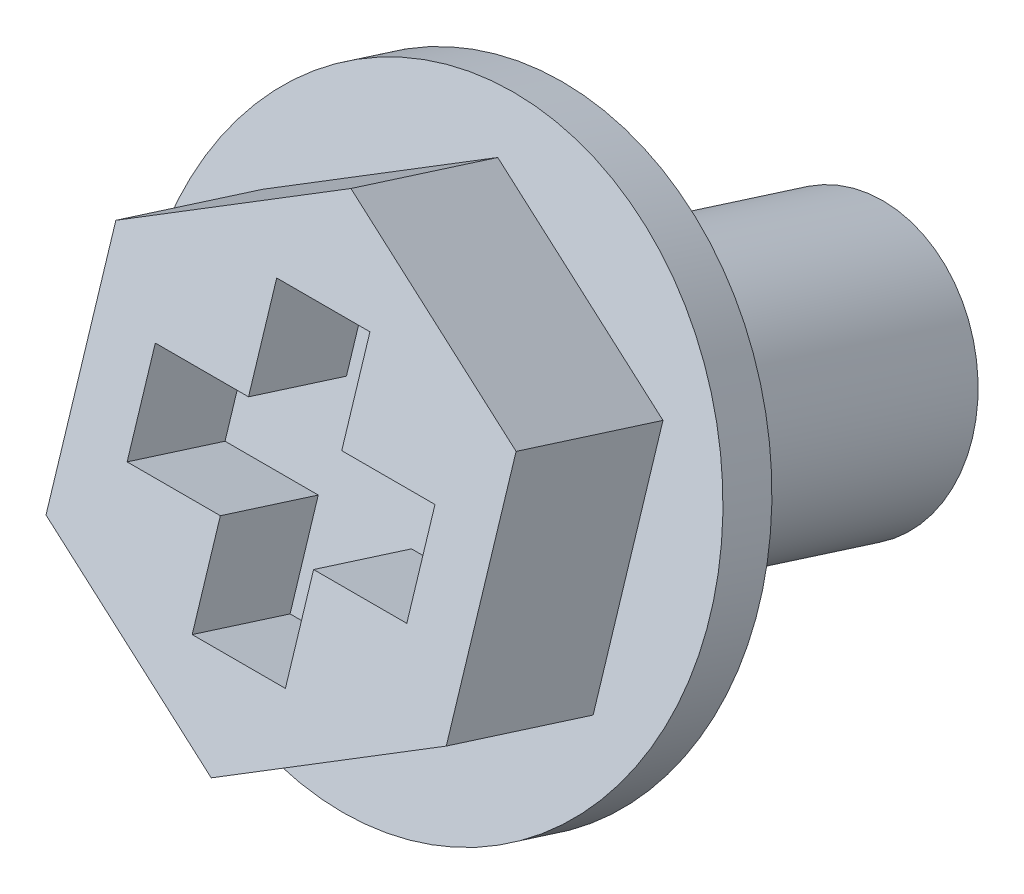
ISO-10303-21;
HEADER;
FILE_DESCRIPTION(('STEP AP214'),'2;1');
FILE_NAME('part.step','',(''),(''),'','','');
FILE_SCHEMA(('AUTOMOTIVE_DESIGN { 1 0 10303 214 1 1 1 1 }'));
ENDSEC;
DATA;
#1=APPLICATION_CONTEXT('core data for automotive mechanical design processes');
#2=APPLICATION_PROTOCOL_DEFINITION('international standard','automotive_design',2000,#1);
#3=PRODUCT_CONTEXT('',#1,'mechanical');
#4=PRODUCT('Part','Part','',(#3));
#5=PRODUCT_RELATED_PRODUCT_CATEGORY('part','',(#4));
#6=PRODUCT_DEFINITION_FORMATION('','',#4);
#7=PRODUCT_DEFINITION_CONTEXT('part definition',#1,'design');
#8=PRODUCT_DEFINITION('design','',#6,#7);
#9=PRODUCT_DEFINITION_SHAPE('','',#8);
#10=(LENGTH_UNIT() NAMED_UNIT(*) SI_UNIT(.MILLI.,.METRE.));
#11=(NAMED_UNIT(*) PLANE_ANGLE_UNIT() SI_UNIT($,.RADIAN.));
#12=(NAMED_UNIT(*) SI_UNIT($,.STERADIAN.) SOLID_ANGLE_UNIT());
#13=UNCERTAINTY_MEASURE_WITH_UNIT(LENGTH_MEASURE(1.E-05),#10,'distance_accuracy_value','');
#14=(GEOMETRIC_REPRESENTATION_CONTEXT(3) GLOBAL_UNCERTAINTY_ASSIGNED_CONTEXT((#13)) GLOBAL_UNIT_ASSIGNED_CONTEXT((#10,
#11,#12)) REPRESENTATION_CONTEXT('',''));
#15=CARTESIAN_POINT('',(0.,0.,0.));
#16=DIRECTION('',(0.,0.,1.));
#17=DIRECTION('',(1.,0.,0.));
#18=AXIS2_PLACEMENT_3D('',#15,#16,#17);
#19=CARTESIAN_POINT('',(-127.5890637903,-47.17862964954,96.08173783615));
#20=DIRECTION('',(0.,0.302243860733609,0.95323063769942));
#21=DIRECTION('',(0.,0.95323063769942,-0.302243860733609));
#22=AXIS2_PLACEMENT_3D('',#19,#20,#21);
#23=PLANE('',#22);
#24=DIRECTION('',(-1.,0.,0.));
#25=VECTOR('',#24,1.);
#26=CARTESIAN_POINT('',(-132.23623307405,-43.6140055370607,94.9514911663381));
#27=LINE('',#26,#25);
#28=CARTESIAN_POINT('',(-131.328582823293,-43.6140055370648,94.9514911663404));
#29=VERTEX_POINT('',#28);
#30=CARTESIAN_POINT('',(-133.143883324725,-43.6140055370635,94.9514911663399));
#31=VERTEX_POINT('',#30);
#32=EDGE_CURVE('E167',#29,#31,#27,.T.);
#33=ORIENTED_EDGE('',*,*,#32,.T.);
#34=DIRECTION('',(0.,-0.953230637698745,0.302243860735739));
#35=VECTOR('',#34,1.);
#36=CARTESIAN_POINT('',(-133.1438833247,-44.4792055643657,95.225822882313));
#37=LINE('',#36,#35);
#38=CARTESIAN_POINT('',(-133.143883324725,-45.3444055916671,95.500154598288));
#39=VERTEX_POINT('',#38);
#40=EDGE_CURVE('E149',#31,#39,#37,.T.);
#41=ORIENTED_EDGE('',*,*,#40,.T.);
#42=DIRECTION('',(1.,0.,0.));
#43=VECTOR('',#42,1.);
#44=CARTESIAN_POINT('',(-132.23623307405,-45.3444055916706,95.5001545982879));
#45=LINE('',#44,#43);
#46=CARTESIAN_POINT('',(-131.328582823307,-45.3444055916672,95.5001545982876));
#47=VERTEX_POINT('',#46);
#48=EDGE_CURVE('E155',#39,#47,#45,.T.);
#49=ORIENTED_EDGE('',*,*,#48,.T.);
#50=DIRECTION('',(0.,-0.95323063770021,0.302243860731118));
#51=VECTOR('',#50,1.);
#52=CARTESIAN_POINT('',(-131.3285828233,-46.2096056189657,95.774486314258));
#53=LINE('',#52,#51);
#54=CARTESIAN_POINT('',(-131.328582823278,-47.0748056462668,96.048818030231));
#55=VERTEX_POINT('',#54);
#56=EDGE_CURVE('E272',#47,#55,#53,.T.);
#57=ORIENTED_EDGE('',*,*,#56,.T.);
#58=DIRECTION('',(1.,0.,0.));
#59=VECTOR('',#58,1.);
#60=CARTESIAN_POINT('',(-130.42093257255,-47.0748056462706,96.0488180302281));
#61=LINE('',#60,#59);
#62=CARTESIAN_POINT('',(-129.513282321847,-47.0748056462669,96.048818030231));
#63=VERTEX_POINT('',#62);
#64=EDGE_CURVE('E278',#55,#63,#61,.T.);
#65=ORIENTED_EDGE('',*,*,#64,.T.);
#66=DIRECTION('',(0.,0.95323063770021,-0.302243860731118));
#67=VECTOR('',#66,1.);
#68=CARTESIAN_POINT('',(-129.5132823219,-46.2096056189657,95.774486314258));
#69=LINE('',#68,#67);
#70=CARTESIAN_POINT('',(-129.513282321857,-45.3444055916658,95.5001545982876));
#71=VERTEX_POINT('',#70);
#72=EDGE_CURVE('E284',#63,#71,#69,.T.);
#73=ORIENTED_EDGE('',*,*,#72,.T.);
#74=DIRECTION('',(1.,0.,0.));
#75=VECTOR('',#74,1.);
#76=CARTESIAN_POINT('',(-128.60563207115,-45.3444055916706,95.5001545982879));
#77=LINE('',#76,#75);
#78=CARTESIAN_POINT('',(-127.6979818204,-45.3444055916672,95.5001545982881));
#79=VERTEX_POINT('',#78);
#80=EDGE_CURVE('E290',#71,#79,#77,.T.);
#81=ORIENTED_EDGE('',*,*,#80,.T.);
#82=DIRECTION('',(0.,0.953230637698745,-0.302243860735739));
#83=VECTOR('',#82,1.);
#84=CARTESIAN_POINT('',(-127.6979818204,-44.4792055643657,95.225822882313));
#85=LINE('',#84,#83);
#86=CARTESIAN_POINT('',(-127.6979818204,-43.6140055370635,94.9514911663399));
#87=VERTEX_POINT('',#86);
#88=EDGE_CURVE('E296',#79,#87,#85,.T.);
#89=ORIENTED_EDGE('',*,*,#88,.T.);
#90=DIRECTION('',(-1.,0.,0.));
#91=VECTOR('',#90,1.);
#92=CARTESIAN_POINT('',(-128.60563207115,-43.6140055370607,94.9514911663381));
#93=LINE('',#92,#91);
#94=CARTESIAN_POINT('',(-129.513282321857,-43.6140055370649,94.9514911663404));
#95=VERTEX_POINT('',#94);
#96=EDGE_CURVE('E302',#87,#95,#93,.T.);
#97=ORIENTED_EDGE('',*,*,#96,.T.);
#98=DIRECTION('',(0.,0.953230637700231,-0.302243860731052));
#99=VECTOR('',#98,1.);
#100=CARTESIAN_POINT('',(-129.5132823219,-42.7488055097657,94.6771594503679));
#101=LINE('',#100,#99);
#102=CARTESIAN_POINT('',(-129.513282321847,-41.8836054824638,94.4028277343946));
#103=VERTEX_POINT('',#102);
#104=EDGE_CURVE('E308',#95,#103,#101,.T.);
#105=ORIENTED_EDGE('',*,*,#104,.T.);
#106=DIRECTION('',(-1.,0.,0.));
#107=VECTOR('',#106,1.);
#108=CARTESIAN_POINT('',(-130.42093257255,-41.8836054824608,94.4028277343881));
#109=LINE('',#108,#107);
#110=CARTESIAN_POINT('',(-131.328582823278,-41.8836054824638,94.4028277343945));
#111=VERTEX_POINT('',#110);
#112=EDGE_CURVE('E314',#103,#111,#109,.T.);
#113=ORIENTED_EDGE('',*,*,#112,.T.);
#114=DIRECTION('',(0.,-0.953230637700231,0.302243860731052));
#115=VECTOR('',#114,1.);
#116=CARTESIAN_POINT('',(-131.3285828233,-42.7488055097657,94.6771594503679));
#117=LINE('',#116,#115);
#118=EDGE_CURVE('E320',#111,#29,#117,.T.);
#119=ORIENTED_EDGE('',*,*,#118,.T.);
#120=EDGE_LOOP('',(#33,#41,#49,#57,#65,#73,#81,#89,#97,#105,#113,#119));
#121=FACE_BOUND('',#120,.T.);
#122=ADVANCED_FACE('F17',(#121),#23,.T.);
#123=CARTESIAN_POINT('',(-133.1801893348,-45.3564953461,95.46202537278));
#124=DIRECTION('',(0.,-0.95323063769864,0.30224386073607));
#125=DIRECTION('',(1.,0.,0.));
#126=AXIS2_PLACEMENT_3D('',#123,#124,#125);
#127=PLANE('',#126);
#128=ORIENTED_EDGE('',*,*,#48,.F.);
#129=DIRECTION('',(0.,0.302243860735946,0.953230637698679));
#130=VECTOR('',#129,1.);
#131=CARTESIAN_POINT('',(-133.1438833247,-45.0421617309328,96.453385235986));
#132=LINE('',#131,#130);
#133=CARTESIAN_POINT('',(-133.143883324747,-44.739917870199,97.4066158736839));
#134=VERTEX_POINT('',#133);
#135=EDGE_CURVE('E158',#39,#134,#132,.T.);
#136=ORIENTED_EDGE('',*,*,#135,.T.);
#137=DIRECTION('',(-1.,0.,0.));
#138=VECTOR('',#137,1.);
#139=CARTESIAN_POINT('',(-130.4209325726,-44.7399178701997,97.4066158736883));
#140=LINE('',#139,#138);
#141=CARTESIAN_POINT('',(-131.328582823319,-44.7399178702,97.4066158736834));
#142=VERTEX_POINT('',#141);
#143=EDGE_CURVE('E267',#142,#134,#140,.T.);
#144=ORIENTED_EDGE('',*,*,#143,.F.);
#145=DIRECTION('',(0.,-0.302243860731755,-0.953230637700008));
#146=VECTOR('',#145,1.);
#147=CARTESIAN_POINT('',(-131.3285828233,-45.042161730932,96.4533852359839));
#148=LINE('',#147,#146);
#149=EDGE_CURVE('E160',#142,#47,#148,.T.);
#150=ORIENTED_EDGE('',*,*,#149,.T.);
#151=EDGE_LOOP('',(#128,#136,#144,#150));
#152=FACE_BOUND('',#151,.T.);
#153=ADVANCED_FACE('F156',(#152),#127,.F.);
#154=CARTESIAN_POINT('',(-133.1438833247,-43.5914872904,94.90238867219));
#155=DIRECTION('',(-1.,0.,0.));
#156=DIRECTION('',(0.,-0.953230637698724,0.302243860735803));
#157=AXIS2_PLACEMENT_3D('',#154,#155,#156);
#158=PLANE('',#157);
#159=ORIENTED_EDGE('',*,*,#40,.F.);
#160=DIRECTION('',(0.,0.302243860730305,0.953230637700467));
#161=VECTOR('',#160,1.);
#162=CARTESIAN_POINT('',(-133.143883324771,-43.31176167633,95.90472180404));
#163=LINE('',#162,#161);
#164=CARTESIAN_POINT('',(-133.14388332473,-43.0095178156005,96.8579524417413));
#165=VERTEX_POINT('',#164);
#166=EDGE_CURVE('E322',#31,#165,#163,.T.);
#167=ORIENTED_EDGE('',*,*,#166,.T.);
#168=DIRECTION('',(0.,0.95323063769925,-0.302243860734144));
#169=VECTOR('',#168,1.);
#170=CARTESIAN_POINT('',(-133.143883324748,-43.8747178429,97.132284157715));
#171=LINE('',#170,#169);
#172=EDGE_CURVE('E166',#134,#165,#171,.T.);
#173=ORIENTED_EDGE('',*,*,#172,.F.);
#174=ORIENTED_EDGE('',*,*,#135,.F.);
#175=EDGE_LOOP('',(#159,#167,#173,#174));
#176=FACE_BOUND('',#175,.T.);
#177=ADVANCED_FACE('F165',(#176),#158,.F.);
#178=CARTESIAN_POINT('',(-131.2922768133,-43.62609529149,94.91336194083));
#179=DIRECTION('',(0.,0.953230637700467,-0.302243860730305));
#180=DIRECTION('',(-1.,0.,0.));
#181=AXIS2_PLACEMENT_3D('',#178,#179,#180);
#182=PLANE('',#181);
#183=ORIENTED_EDGE('',*,*,#32,.F.);
#184=DIRECTION('',(0.,0.302243860735982,0.953230637698667));
#185=VECTOR('',#184,1.);
#186=CARTESIAN_POINT('',(-131.3285828233,-43.3117616763328,95.9047218040361));
#187=LINE('',#186,#185);
#188=CARTESIAN_POINT('',(-131.328582823318,-43.009517815599,96.8579524417397));
#189=VERTEX_POINT('',#188);
#190=EDGE_CURVE('E317',#29,#189,#187,.T.);
#191=ORIENTED_EDGE('',*,*,#190,.T.);
#192=DIRECTION('',(1.,0.,0.));
#193=VECTOR('',#192,1.);
#194=CARTESIAN_POINT('',(-130.4209325726,-43.0095178156003,96.8579524417417));
#195=LINE('',#194,#193);
#196=EDGE_CURVE('E264',#165,#189,#195,.T.);
#197=ORIENTED_EDGE('',*,*,#196,.F.);
#198=ORIENTED_EDGE('',*,*,#166,.F.);
#199=EDGE_LOOP('',(#183,#191,#197,#198));
#200=FACE_BOUND('',#199,.T.);
#201=ADVANCED_FACE('F325',(#200),#182,.F.);
#202=CARTESIAN_POINT('',(-131.3285828233,-41.8610872358,94.35372524025));
#203=DIRECTION('',(-1.,0.,0.));
#204=DIRECTION('',(0.,-0.953230637700243,0.302243860731015));
#205=AXIS2_PLACEMENT_3D('',#202,#203,#204);
#206=PLANE('',#205);
#207=ORIENTED_EDGE('',*,*,#118,.F.);
#208=DIRECTION('',(0.,0.302243860730318,0.953230637700463));
#209=VECTOR('',#208,1.);
#210=CARTESIAN_POINT('',(-131.328582823271,-41.58136162173,95.35605837209));
#211=LINE('',#210,#209);
#212=CARTESIAN_POINT('',(-131.328582823297,-41.2791177610006,96.3092890097923));
#213=VERTEX_POINT('',#212);
#214=EDGE_CURVE('E311',#111,#213,#211,.T.);
#215=ORIENTED_EDGE('',*,*,#214,.T.);
#216=DIRECTION('',(0.,0.95323063769925,-0.302243860734144));
#217=VECTOR('',#216,1.);
#218=CARTESIAN_POINT('',(-131.328582823316,-43.8747178429,97.132284157715));
#219=LINE('',#218,#217);
#220=EDGE_CURVE('E262',#189,#213,#219,.T.);
#221=ORIENTED_EDGE('',*,*,#220,.F.);
#222=ORIENTED_EDGE('',*,*,#190,.F.);
#223=EDGE_LOOP('',(#207,#215,#221,#222));
#224=FACE_BOUND('',#223,.T.);
#225=ADVANCED_FACE('F362',(#224),#206,.F.);
#226=CARTESIAN_POINT('',(-129.4769763118,-41.89569523689,94.36469850888));
#227=DIRECTION('',(0.,0.953230637700463,-0.302243860730318));
#228=DIRECTION('',(-1.,0.,0.));
#229=AXIS2_PLACEMENT_3D('',#226,#227,#228);
#230=PLANE('',#229);
#231=ORIENTED_EDGE('',*,*,#112,.F.);
#232=DIRECTION('',(0.,0.302243860731772,0.953230637700002));
#233=VECTOR('',#232,1.);
#234=CARTESIAN_POINT('',(-129.5132823219,-41.5813616217322,95.3560583720939));
#235=LINE('',#234,#233);
#236=CARTESIAN_POINT('',(-129.51328232186,-41.2791177610003,96.3092890097925));
#237=VERTEX_POINT('',#236);
#238=EDGE_CURVE('E305',#103,#237,#235,.T.);
#239=ORIENTED_EDGE('',*,*,#238,.T.);
#240=DIRECTION('',(1.,0.,0.));
#241=VECTOR('',#240,1.);
#242=CARTESIAN_POINT('',(-130.4209325726,-41.2791177610011,96.3092890097952));
#243=LINE('',#242,#241);
#244=EDGE_CURVE('E260',#213,#237,#243,.T.);
#245=ORIENTED_EDGE('',*,*,#244,.F.);
#246=ORIENTED_EDGE('',*,*,#214,.F.);
#247=EDGE_LOOP('',(#231,#239,#245,#246));
#248=FACE_BOUND('',#247,.T.);
#249=ADVANCED_FACE('F359',(#248),#230,.F.);
#250=CARTESIAN_POINT('',(-129.5132823219,-43.66070329259,94.92433520947));
#251=DIRECTION('',(1.,0.,0.));
#252=DIRECTION('',(0.,0.953230637700243,-0.302243860731015));
#253=AXIS2_PLACEMENT_3D('',#250,#251,#252);
#254=PLANE('',#253);
#255=ORIENTED_EDGE('',*,*,#104,.F.);
#256=DIRECTION('',(0.,0.302243860730305,0.953230637700467));
#257=VECTOR('',#256,1.);
#258=CARTESIAN_POINT('',(-129.513282321871,-43.31176167633,95.90472180404));
#259=LINE('',#258,#257);
#260=CARTESIAN_POINT('',(-129.513282321889,-43.0095178155986,96.8579524417375));
#261=VERTEX_POINT('',#260);
#262=EDGE_CURVE('E299',#95,#261,#259,.T.);
#263=ORIENTED_EDGE('',*,*,#262,.T.);
#264=DIRECTION('',(0.,-0.953230637699251,0.302243860734143));
#265=VECTOR('',#264,1.);
#266=CARTESIAN_POINT('',(-129.513282321884,-43.8747178429,97.132284157715));
#267=LINE('',#266,#265);
#268=EDGE_CURVE('E258',#237,#261,#267,.T.);
#269=ORIENTED_EDGE('',*,*,#268,.F.);
#270=ORIENTED_EDGE('',*,*,#238,.F.);
#271=EDGE_LOOP('',(#255,#263,#269,#270));
#272=FACE_BOUND('',#271,.T.);
#273=ADVANCED_FACE('F355',(#272),#254,.F.);
#274=CARTESIAN_POINT('',(-127.6616758104,-43.62609529149,94.91336194083));
#275=DIRECTION('',(0.,0.953230637700467,-0.302243860730305));
#276=DIRECTION('',(-1.,0.,0.));
#277=AXIS2_PLACEMENT_3D('',#274,#275,#276);
#278=PLANE('',#277);
#279=ORIENTED_EDGE('',*,*,#96,.F.);
#280=DIRECTION('',(0.,0.302243860730414,0.953230637700433));
#281=VECTOR('',#280,1.);
#282=CARTESIAN_POINT('',(-127.6979818204,-43.3117616763323,95.904721804039));
#283=LINE('',#282,#281);
#284=CARTESIAN_POINT('',(-127.697981820427,-43.0095178156,96.8579524417416));
#285=VERTEX_POINT('',#284);
#286=EDGE_CURVE('E293',#87,#285,#283,.T.);
#287=ORIENTED_EDGE('',*,*,#286,.T.);
#288=DIRECTION('',(1.,0.,0.));
#289=VECTOR('',#288,1.);
#290=CARTESIAN_POINT('',(-130.4209325726,-43.0095178156003,96.8579524417417));
#291=LINE('',#290,#289);
#292=EDGE_CURVE('E256',#261,#285,#291,.T.);
#293=ORIENTED_EDGE('',*,*,#292,.F.);
#294=ORIENTED_EDGE('',*,*,#262,.F.);
#295=EDGE_LOOP('',(#279,#287,#293,#294));
#296=FACE_BOUND('',#295,.T.);
#297=ADVANCED_FACE('F351',(#296),#278,.F.);
#298=CARTESIAN_POINT('',(-127.6979818204,-45.39110334719,95.47299864142));
#299=DIRECTION('',(1.,0.,0.));
#300=DIRECTION('',(0.,0.953230637698724,-0.302243860735803));
#301=AXIS2_PLACEMENT_3D('',#298,#299,#300);
#302=PLANE('',#301);
#303=ORIENTED_EDGE('',*,*,#88,.F.);
#304=DIRECTION('',(0.,0.30224386073607,0.95323063769864));
#305=VECTOR('',#304,1.);
#306=CARTESIAN_POINT('',(-127.697981820429,-45.042161730935,96.453385235985));
#307=LINE('',#306,#305);
#308=CARTESIAN_POINT('',(-127.69798182042,-44.7399178701985,97.4066158736842));
#309=VERTEX_POINT('',#308);
#310=EDGE_CURVE('E287',#79,#309,#307,.T.);
#311=ORIENTED_EDGE('',*,*,#310,.T.);
#312=DIRECTION('',(0.,-0.95323063769925,0.302243860734144));
#313=VECTOR('',#312,1.);
#314=CARTESIAN_POINT('',(-127.697981820452,-43.8747178429,97.132284157715));
#315=LINE('',#314,#313);
#316=EDGE_CURVE('E254',#285,#309,#315,.T.);
#317=ORIENTED_EDGE('',*,*,#316,.F.);
#318=ORIENTED_EDGE('',*,*,#286,.F.);
#319=EDGE_LOOP('',(#303,#311,#317,#318));
#320=FACE_BOUND('',#319,.T.);
#321=ADVANCED_FACE('F347',(#320),#302,.F.);
#322=CARTESIAN_POINT('',(-129.5495883319,-45.3564953461,95.46202537278));
#323=DIRECTION('',(0.,-0.95323063769864,0.30224386073607));
#324=DIRECTION('',(1.,0.,0.));
#325=AXIS2_PLACEMENT_3D('',#322,#323,#324);
#326=PLANE('',#325);
#327=ORIENTED_EDGE('',*,*,#80,.F.);
#328=DIRECTION('',(0.,0.302243860731753,0.953230637700008));
#329=VECTOR('',#328,1.);
#330=CARTESIAN_POINT('',(-129.5132823219,-45.0421617309323,96.453385235984));
#331=LINE('',#330,#329);
#332=CARTESIAN_POINT('',(-129.513282321882,-44.7399178702,97.4066158736834));
#333=VERTEX_POINT('',#332);
#334=EDGE_CURVE('E281',#71,#333,#331,.T.);
#335=ORIENTED_EDGE('',*,*,#334,.T.);
#336=DIRECTION('',(-1.,0.,0.));
#337=VECTOR('',#336,1.);
#338=CARTESIAN_POINT('',(-130.4209325726,-44.7399178701997,97.4066158736883));
#339=LINE('',#338,#337);
#340=EDGE_CURVE('E252',#309,#333,#339,.T.);
#341=ORIENTED_EDGE('',*,*,#340,.F.);
#342=ORIENTED_EDGE('',*,*,#310,.F.);
#343=EDGE_LOOP('',(#327,#335,#341,#342));
#344=FACE_BOUND('',#343,.T.);
#345=ADVANCED_FACE('F343',(#344),#326,.F.);
#346=CARTESIAN_POINT('',(-129.5132823219,-47.12150340179,96.02166207336));
#347=DIRECTION('',(1.,0.,0.));
#348=DIRECTION('',(0.,0.953230637700249,-0.302243860730994));
#349=AXIS2_PLACEMENT_3D('',#346,#347,#348);
#350=PLANE('',#349);
#351=ORIENTED_EDGE('',*,*,#72,.F.);
#352=DIRECTION('',(0.,0.302243860734677,0.953230637699081));
#353=VECTOR('',#352,1.);
#354=CARTESIAN_POINT('',(-129.513282321829,-46.772561785535,97.00204866793));
#355=LINE('',#354,#353);
#356=CARTESIAN_POINT('',(-129.513282321878,-46.4703179247983,97.9552793056331));
#357=VERTEX_POINT('',#356);
#358=EDGE_CURVE('E275',#63,#357,#355,.T.);
#359=ORIENTED_EDGE('',*,*,#358,.T.);
#360=DIRECTION('',(0.,-0.953230637699251,0.302243860734143));
#361=VECTOR('',#360,1.);
#362=CARTESIAN_POINT('',(-129.513282321884,-43.8747178429,97.132284157715));
#363=LINE('',#362,#361);
#364=EDGE_CURVE('E250',#333,#357,#363,.T.);
#365=ORIENTED_EDGE('',*,*,#364,.F.);
#366=ORIENTED_EDGE('',*,*,#334,.F.);
#367=EDGE_LOOP('',(#351,#359,#365,#366));
#368=FACE_BOUND('',#367,.T.);
#369=ADVANCED_FACE('F339',(#368),#350,.F.);
#370=CARTESIAN_POINT('',(-131.3648888333,-47.0868954007,96.01068880472));
#371=DIRECTION('',(0.,-0.953230637699081,0.302243860734677));
#372=DIRECTION('',(1.,0.,0.));
#373=AXIS2_PLACEMENT_3D('',#370,#371,#372);
#374=PLANE('',#373);
#375=ORIENTED_EDGE('',*,*,#64,.F.);
#376=DIRECTION('',(0.,0.302243860734612,0.953230637699102));
#377=VECTOR('',#376,1.);
#378=CARTESIAN_POINT('',(-131.3285828233,-46.7725617855327,97.002048667931));
#379=LINE('',#378,#377);
#380=CARTESIAN_POINT('',(-131.32858282329,-46.4703179247988,97.9552793056329));
#381=VERTEX_POINT('',#380);
#382=EDGE_CURVE('E269',#55,#381,#379,.T.);
#383=ORIENTED_EDGE('',*,*,#382,.T.);
#384=DIRECTION('',(-1.,0.,0.));
#385=VECTOR('',#384,1.);
#386=CARTESIAN_POINT('',(-130.4209325726,-46.4703179247989,97.9552793056348));
#387=LINE('',#386,#385);
#388=EDGE_CURVE('E248',#357,#381,#387,.T.);
#389=ORIENTED_EDGE('',*,*,#388,.F.);
#390=ORIENTED_EDGE('',*,*,#358,.F.);
#391=EDGE_LOOP('',(#375,#383,#389,#390));
#392=FACE_BOUND('',#391,.T.);
#393=ADVANCED_FACE('F336',(#392),#374,.F.);
#394=CARTESIAN_POINT('',(-131.3285828233,-45.321887345,95.45105210414));
#395=DIRECTION('',(-1.,0.,0.));
#396=DIRECTION('',(0.,-0.953230637700249,0.302243860730994));
#397=AXIS2_PLACEMENT_3D('',#394,#395,#396);
#398=PLANE('',#397);
#399=ORIENTED_EDGE('',*,*,#56,.F.);
#400=ORIENTED_EDGE('',*,*,#149,.F.);
#401=DIRECTION('',(0.,0.95323063769925,-0.302243860734144));
#402=VECTOR('',#401,1.);
#403=CARTESIAN_POINT('',(-131.328582823316,-43.8747178429,97.132284157715));
#404=LINE('',#403,#402);
#405=EDGE_CURVE('E245',#381,#142,#404,.T.);
#406=ORIENTED_EDGE('',*,*,#405,.F.);
#407=ORIENTED_EDGE('',*,*,#382,.F.);
#408=EDGE_LOOP('',(#399,#400,#406,#407));
#409=FACE_BOUND('',#408,.T.);
#410=ADVANCED_FACE('F333',(#409),#398,.F.);
#411=CARTESIAN_POINT('',(-126.3679336829,-48.33583722733,98.54678542595));
#412=DIRECTION('',(0.,0.302243860734144,0.95323063769925));
#413=DIRECTION('',(0.,0.95323063769925,-0.302243860734144));
#414=AXIS2_PLACEMENT_3D('',#411,#412,#413);
#415=PLANE('',#414);
#416=ORIENTED_EDGE('',*,*,#388,.T.);
#417=ORIENTED_EDGE('',*,*,#405,.T.);
#418=ORIENTED_EDGE('',*,*,#143,.T.);
#419=ORIENTED_EDGE('',*,*,#172,.T.);
#420=ORIENTED_EDGE('',*,*,#196,.T.);
#421=ORIENTED_EDGE('',*,*,#220,.T.);
#422=ORIENTED_EDGE('',*,*,#244,.T.);
#423=ORIENTED_EDGE('',*,*,#268,.T.);
#424=ORIENTED_EDGE('',*,*,#292,.T.);
#425=ORIENTED_EDGE('',*,*,#316,.T.);
#426=ORIENTED_EDGE('',*,*,#340,.T.);
#427=ORIENTED_EDGE('',*,*,#364,.T.);
#428=EDGE_LOOP('',(#416,#417,#418,#419,#420,#421,#422,#423,#424,#425,#426,#427));
#429=FACE_BOUND('',#428,.T.);
#430=DIRECTION('',(0.866025403789069,0.476615318842526,-0.151121930362928));
#431=VECTOR('',#430,1.);
#432=CARTESIAN_POINT('',(-132.3694897311,-40.657564440664,96.112211127733));
#433=LINE('',#432,#431);
#434=CARTESIAN_POINT('',(-134.318046889619,-41.7299489080773,96.4522354710616));
#435=VERTEX_POINT('',#434);
#436=CARTESIAN_POINT('',(-130.420932572436,-39.5851799733206,95.7721867844329));
#437=VERTEX_POINT('',#436);
#438=EDGE_CURVE('E192',#435,#437,#433,.T.);
#439=ORIENTED_EDGE('',*,*,#438,.F.);
#440=DIRECTION('',(0.,0.953230637699545,-0.302243860733214));
#441=VECTOR('',#440,1.);
#442=CARTESIAN_POINT('',(-134.3180468896,-43.8747178428991,97.132284157713));
#443=LINE('',#442,#441);
#444=CARTESIAN_POINT('',(-134.318046889634,-46.0194867777211,97.8123328443627));
#445=VERTEX_POINT('',#444);
#446=EDGE_CURVE('E184',#445,#435,#443,.T.);
#447=ORIENTED_EDGE('',*,*,#446,.F.);
#448=DIRECTION('',(-0.866025403788795,0.476615318842377,-0.151121930364968));
#449=VECTOR('',#448,1.);
#450=CARTESIAN_POINT('',(-132.3694897311,-47.091871245134,98.1523571876881));
#451=LINE('',#450,#449);
#452=CARTESIAN_POINT('',(-130.420932572825,-48.1642557124083,98.4923815309728));
#453=VERTEX_POINT('',#452);
#454=EDGE_CURVE('E185',#453,#445,#451,.T.);
#455=ORIENTED_EDGE('',*,*,#454,.F.);
#456=DIRECTION('',(-0.86602540378345,-0.476615318851202,0.151121930367766));
#457=VECTOR('',#456,1.);
#458=CARTESIAN_POINT('',(-128.47237541405,-47.091871245134,98.1523571876881));
#459=LINE('',#458,#457);
#460=CARTESIAN_POINT('',(-126.52381825558,-46.0194867777213,97.812332844363));
#461=VERTEX_POINT('',#460);
#462=EDGE_CURVE('E61',#461,#453,#459,.T.);
#463=ORIENTED_EDGE('',*,*,#462,.F.);
#464=DIRECTION('',(0.,-0.953230637699545,0.302243860733214));
#465=VECTOR('',#464,1.);
#466=CARTESIAN_POINT('',(-126.5238182556,-43.8747178428991,97.132284157713));
#467=LINE('',#466,#465);
#468=CARTESIAN_POINT('',(-126.523818255565,-41.7299489080774,96.4522354710594));
#469=VERTEX_POINT('',#468);
#470=EDGE_CURVE('E179',#469,#461,#467,.T.);
#471=ORIENTED_EDGE('',*,*,#470,.F.);
#472=DIRECTION('',(0.866025403783724,-0.476615318851351,0.151121930365726));
#473=VECTOR('',#472,1.);
#474=CARTESIAN_POINT('',(-128.47237541405,-40.657564440664,96.112211127733));
#475=LINE('',#474,#473);
#476=EDGE_CURVE('E196',#437,#469,#475,.T.);
#477=ORIENTED_EDGE('',*,*,#476,.F.);
#478=EDGE_LOOP('',(#439,#447,#455,#463,#471,#477));
#479=FACE_BOUND('',#478,.T.);
#480=ADVANCED_FACE('F238',(#429,#479),#415,.T.);
#481=CARTESIAN_POINT('',(-134.395989176,-46.90145761287,94.88184611927));
#482=DIRECTION('',(-0.499999999992455,-0.825521947917343,0.261750861534972));
#483=DIRECTION('',(0.866025403788795,-0.476615318842378,0.151121930364965));
#484=AXIS2_PLACEMENT_3D('',#481,#482,#483);
#485=PLANE('',#484);
#486=ORIENTED_EDGE('',*,*,#454,.T.);
#487=DIRECTION('',(0.,0.302243860734128,0.953230637699255));
#488=VECTOR('',#487,1.);
#489=CARTESIAN_POINT('',(-134.3180468896,-46.4728525688221,96.382486887814));
#490=LINE('',#489,#488);
#491=CARTESIAN_POINT('',(-134.318046889617,-46.9262183599268,94.9526409312632));
#492=VERTEX_POINT('',#491);
#493=EDGE_CURVE('E181',#492,#445,#490,.T.);
#494=ORIENTED_EDGE('',*,*,#493,.F.);
#495=DIRECTION('',(-0.866025403784423,0.476615318849636,-0.151121930367129));
#496=VECTOR('',#495,1.);
#497=CARTESIAN_POINT('',(-130.4209325726,-49.0709872947468,95.6326896179142));
#498=LINE('',#497,#496);
#499=CARTESIAN_POINT('',(-130.420932572582,-49.0709872947522,95.6326896179159));
#500=VERTEX_POINT('',#499);
#501=EDGE_CURVE('E21',#500,#492,#498,.T.);
#502=ORIENTED_EDGE('',*,*,#501,.F.);
#503=DIRECTION('',(0.,-0.302243860734146,-0.953230637699249));
#504=VECTOR('',#503,1.);
#505=CARTESIAN_POINT('',(-130.42093257256,-48.6176215036485,97.0625355744669));
#506=LINE('',#505,#504);
#507=EDGE_CURVE('E55',#453,#500,#506,.T.);
#508=ORIENTED_EDGE('',*,*,#507,.F.);
#509=EDGE_LOOP('',(#486,#494,#502,#508));
#510=FACE_BOUND('',#509,.T.);
#511=ADVANCED_FACE('F233',(#510),#485,.T.);
#512=CARTESIAN_POINT('',(-134.3180468896,-42.56902436453,93.50814777223));
#513=DIRECTION('',(-1.,0.,0.));
#514=DIRECTION('',(0.,-0.953230637698942,0.302243860735116));
#515=AXIS2_PLACEMENT_3D('',#512,#513,#514);
#516=PLANE('',#515);
#517=ORIENTED_EDGE('',*,*,#446,.T.);
#518=DIRECTION('',(0.,0.302243860734125,0.953230637699256));
#519=VECTOR('',#518,1.);
#520=CARTESIAN_POINT('',(-134.318046889658,-42.1833146991785,95.022389514507));
#521=LINE('',#520,#519);
#522=CARTESIAN_POINT('',(-134.318046889642,-42.6366804902803,93.5925435579591));
#523=VERTEX_POINT('',#522);
#524=EDGE_CURVE('E189',#523,#435,#521,.T.);
#525=ORIENTED_EDGE('',*,*,#524,.F.);
#526=DIRECTION('',(0.,0.953230637699219,-0.302243860734242));
#527=VECTOR('',#526,1.);
#528=CARTESIAN_POINT('',(-134.31804688963,-44.7814494251,94.27259224461));
#529=LINE('',#528,#527);
#530=EDGE_CURVE('E186',#492,#523,#529,.T.);
#531=ORIENTED_EDGE('',*,*,#530,.F.);
#532=ORIENTED_EDGE('',*,*,#493,.T.);
#533=EDGE_LOOP('',(#517,#525,#531,#532));
#534=FACE_BOUND('',#533,.T.);
#535=ADVANCED_FACE('F236',(#534),#516,.T.);
#536=CARTESIAN_POINT('',(-130.3429902862,-40.4671508084,92.84170005931));
#537=DIRECTION('',(-0.499999999992454,0.825521947917597,-0.261750861534172));
#538=DIRECTION('',(-0.866025403788795,-0.476615318842374,0.151121930364977));
#539=AXIS2_PLACEMENT_3D('',#536,#537,#538);
#540=PLANE('',#539);
#541=ORIENTED_EDGE('',*,*,#438,.T.);
#542=DIRECTION('',(0.,0.30224386073324,0.953230637699537));
#543=VECTOR('',#542,1.);
#544=CARTESIAN_POINT('',(-130.42093257256,-40.0385457643515,94.342340827858));
#545=LINE('',#544,#543);
#546=CARTESIAN_POINT('',(-130.420932572582,-40.4919115554487,92.9124948713044));
#547=VERTEX_POINT('',#546);
#548=EDGE_CURVE('E193',#547,#437,#545,.T.);
#549=ORIENTED_EDGE('',*,*,#548,.F.);
#550=DIRECTION('',(0.866025403784424,0.476615318849633,-0.151121930367129));
#551=VECTOR('',#550,1.);
#552=CARTESIAN_POINT('',(-134.31804688963,-42.6366804902766,93.5925435579579));
#553=LINE('',#552,#551);
#554=EDGE_CURVE('E188',#523,#547,#553,.T.);
#555=ORIENTED_EDGE('',*,*,#554,.F.);
#556=ORIENTED_EDGE('',*,*,#524,.T.);
#557=EDGE_LOOP('',(#541,#549,#555,#556));
#558=FACE_BOUND('',#557,.T.);
#559=ADVANCED_FACE('F221',(#558),#540,.T.);
#560=CARTESIAN_POINT('',(-126.4458759692,-42.69771050062,93.54895069343));
#561=DIRECTION('',(0.500000000001712,0.825521947912249,-0.261750861533357));
#562=DIRECTION('',(-0.86602540378345,0.476615318851199,-0.151121930367775));
#563=AXIS2_PLACEMENT_3D('',#560,#561,#562);
#564=PLANE('',#563);
#565=ORIENTED_EDGE('',*,*,#476,.T.);
#566=DIRECTION('',(0.,0.302243860733241,0.953230637699536));
#567=VECTOR('',#566,1.);
#568=CARTESIAN_POINT('',(-126.5238182556,-42.1833146991779,95.0223895145111));
#569=LINE('',#568,#567);
#570=CARTESIAN_POINT('',(-126.523818255583,-42.6366804902742,93.5925435579571));
#571=VERTEX_POINT('',#570);
#572=EDGE_CURVE('E197',#571,#469,#569,.T.);
#573=ORIENTED_EDGE('',*,*,#572,.F.);
#574=DIRECTION('',(0.866025403784423,-0.476615318849636,0.15112193036713));
#575=VECTOR('',#574,1.);
#576=CARTESIAN_POINT('',(-130.4209325726,-40.4919115554532,92.9124948713058));
#577=LINE('',#576,#575);
#578=EDGE_CURVE('E176',#547,#571,#577,.T.);
#579=ORIENTED_EDGE('',*,*,#578,.F.);
#580=ORIENTED_EDGE('',*,*,#548,.T.);
#581=EDGE_LOOP('',(#565,#573,#579,#580));
#582=FACE_BOUND('',#581,.T.);
#583=ADVANCED_FACE('F225',(#582),#564,.T.);
#584=CARTESIAN_POINT('',(-126.5238182556,-47.03014374896,94.92264904047));
#585=DIRECTION('',(1.,0.,0.));
#586=DIRECTION('',(0.,0.953230637698942,-0.302243860735116));
#587=AXIS2_PLACEMENT_3D('',#584,#585,#586);
#588=PLANE('',#587);
#589=ORIENTED_EDGE('',*,*,#470,.T.);
#590=DIRECTION('',(0.,0.302243860734148,0.953230637699249));
#591=VECTOR('',#590,1.);
#592=CARTESIAN_POINT('',(-126.52381825554,-46.4728525688215,96.3824868878131));
#593=LINE('',#592,#591);
#594=CARTESIAN_POINT('',(-126.523818255557,-46.9262183599204,94.9526409312611));
#595=VERTEX_POINT('',#594);
#596=EDGE_CURVE('E177',#595,#461,#593,.T.);
#597=ORIENTED_EDGE('',*,*,#596,.F.);
#598=DIRECTION('',(0.,-0.95323063769922,0.302243860734241));
#599=VECTOR('',#598,1.);
#600=CARTESIAN_POINT('',(-126.52381825557,-44.7814494251,94.27259224461));
#601=LINE('',#600,#599);
#602=EDGE_CURVE('E36',#571,#595,#601,.T.);
#603=ORIENTED_EDGE('',*,*,#602,.F.);
#604=ORIENTED_EDGE('',*,*,#572,.T.);
#605=EDGE_LOOP('',(#589,#597,#603,#604));
#606=FACE_BOUND('',#605,.T.);
#607=ADVANCED_FACE('F228',(#606),#588,.T.);
#608=CARTESIAN_POINT('',(-130.4988748589,-49.13201730509,95.58909675339));
#609=DIRECTION('',(0.500000000001713,-0.825521947912248,0.261750861533358));
#610=DIRECTION('',(0.86602540378345,0.476615318851203,-0.151121930367763));
#611=AXIS2_PLACEMENT_3D('',#608,#609,#610);
#612=PLANE('',#611);
#613=ORIENTED_EDGE('',*,*,#462,.T.);
#614=ORIENTED_EDGE('',*,*,#507,.T.);
#615=DIRECTION('',(-0.866025403784422,-0.476615318849638,0.15112193036713));
#616=VECTOR('',#615,1.);
#617=CARTESIAN_POINT('',(-126.52381825557,-46.9262183599234,94.9526409312621));
#618=LINE('',#617,#616);
#619=EDGE_CURVE('E175',#595,#500,#618,.T.);
#620=ORIENTED_EDGE('',*,*,#619,.F.);
#621=ORIENTED_EDGE('',*,*,#596,.T.);
#622=EDGE_LOOP('',(#613,#614,#620,#621));
#623=FACE_BOUND('',#622,.T.);
#624=ADVANCED_FACE('F229',(#623),#612,.T.);
#625=CARTESIAN_POINT('',(-128.3409325726,-49.48436388201,86.32218373054));
#626=DIRECTION('',(-7.26471172413731E-13,-0.3022438607352,-0.953230637698915));
#627=DIRECTION('',(-1.,2.40359281623325E-12,0.));
#628=AXIS2_PLACEMENT_3D('',#625,#626,#627);
#629=PLANE('',#628);
#630=CARTESIAN_POINT('',(-130.420932572611,-47.5016441717096,85.6935165053215));
#631=DIRECTION('',(-7.26471172413731E-13,-0.3022438607352,-0.953230637698915));
#632=DIRECTION('',(0.,0.953230637698915,-0.3022438607352));
#633=AXIS2_PLACEMENT_3D('',#630,#631,#632);
#634=CIRCLE('',#633,1.9999959881709);
#635=CARTESIAN_POINT('',(-130.4209325726,-49.4081016229191,86.2980030142444));
#636=VERTEX_POINT('',#635);
#637=EDGE_CURVE('E208',#636,#636,#634,.T.);
#638=ORIENTED_EDGE('',*,*,#637,.T.);
#639=EDGE_LOOP('',(#638));
#640=FACE_BOUND('',#639,.T.);
#641=ADVANCED_FACE('F515',(#640),#629,.T.);
#642=CARTESIAN_POINT('',(-124.7009325726,-50.23392867274,96.00142712801));
#643=DIRECTION('',(0.,0.302243860734242,0.953230637699219));
#644=DIRECTION('',(0.,0.953230637699219,-0.302243860734242));
#645=AXIS2_PLACEMENT_3D('',#642,#643,#644);
#646=PLANE('',#645);
#647=ORIENTED_EDGE('',*,*,#602,.T.);
#648=ORIENTED_EDGE('',*,*,#619,.T.);
#649=ORIENTED_EDGE('',*,*,#501,.T.);
#650=ORIENTED_EDGE('',*,*,#530,.T.);
#651=ORIENTED_EDGE('',*,*,#554,.T.);
#652=ORIENTED_EDGE('',*,*,#578,.T.);
#653=EDGE_LOOP('',(#647,#648,#649,#650,#651,#652));
#654=FACE_BOUND('',#653,.T.);
#655=CARTESIAN_POINT('',(-130.4209325726,-44.7814494251063,94.2725922445903));
#656=DIRECTION('',(0.,0.302243860730173,0.953230637700509));
#657=DIRECTION('',(0.,-0.953230637700509,0.302243860730173));
#658=AXIS2_PLACEMENT_3D('',#655,#656,#657);
#659=CIRCLE('',#658,5.49999999999832);
#660=CARTESIAN_POINT('',(-130.4209325726,-50.0242179324574,95.9349334786057));
#661=VERTEX_POINT('',#660);
#662=EDGE_CURVE('E205',#661,#661,#659,.T.);
#663=ORIENTED_EDGE('',*,*,#662,.T.);
#664=EDGE_LOOP('',(#663));
#665=FACE_BOUND('',#664,.T.);
#666=ADVANCED_FACE('F214',(#654,#665),#646,.T.);
#667=CARTESIAN_POINT('',(-130.4209325726,-47.5016435654577,85.6935184173464));
#668=DIRECTION('',(0.,0.302243860730157,0.953230637700514));
#669=DIRECTION('',(0.,-0.953230637700514,0.302243860730157));
#670=AXIS2_PLACEMENT_3D('',#667,#668,#669);
#671=CONICAL_SURFACE('',#670,1.99999799400355,0.785397160483765);
#672=CARTESIAN_POINT('',(-130.4209325726,-47.3505207256665,86.1701366043868));
#673=DIRECTION('',(0.,0.302243860730157,0.953230637700514));
#674=DIRECTION('',(0.,-0.953230637700514,0.302243860730157));
#675=AXIS2_PLACEMENT_3D('',#672,#673,#674);
#676=CIRCLE('',#675,2.5);
#677=CARTESIAN_POINT('',(-130.4209325726,-49.7335973199178,86.9257462562122));
#678=VERTEX_POINT('',#677);
#679=EDGE_CURVE('E202',#678,#678,#676,.F.);
#680=CARTESIAN_POINT('',(-130.4209325726,-49.7335973199178,86.9257462562122));
#681=CARTESIAN_POINT('',(-130.4209325726,-49.7302067397407,86.9192072641084));
#682=CARTESIAN_POINT('',(-130.4209325726,-49.7268161595636,86.9126682720045));
#683=CARTESIAN_POINT('',(-130.4209325726,-49.7200349992095,86.8995902877969));
#684=CARTESIAN_POINT('',(-130.4209325726,-49.7166444190324,86.893051295693));
#685=CARTESIAN_POINT('',(-130.4209325726,-49.7098632586783,86.8799733114854));
#686=CARTESIAN_POINT('',(-130.4209325726,-49.7064726785012,86.8734343193815));
#687=CARTESIAN_POINT('',(-130.4209325726,-49.6996915181471,86.8603563351739));
#688=CARTESIAN_POINT('',(-130.4209325726,-49.69630093797,86.85381734307));
#689=CARTESIAN_POINT('',(-130.4209325726,-49.6895197776159,86.8407393588624));
#690=CARTESIAN_POINT('',(-130.4209325726,-49.6861291974388,86.8342003667585));
#691=CARTESIAN_POINT('',(-130.4209325726,-49.6793480370847,86.8211223825509));
#692=CARTESIAN_POINT('',(-130.4209325726,-49.6759574569076,86.8145833904471));
#693=CARTESIAN_POINT('',(-130.4209325726,-49.6691762965535,86.8015054062394));
#694=CARTESIAN_POINT('',(-130.4209325726,-49.6657857163764,86.7949664141356));
#695=CARTESIAN_POINT('',(-130.4209325726,-49.6590045560222,86.7818884299279));
#696=CARTESIAN_POINT('',(-130.4209325726,-49.6556139758452,86.7753494378241));
#697=CARTESIAN_POINT('',(-130.4209325726,-49.648832815491,86.7622714536164));
#698=CARTESIAN_POINT('',(-130.4209325726,-49.645442235314,86.7557324615126));
#699=CARTESIAN_POINT('',(-130.4209325726,-49.6386610749598,86.7426544773049));
#700=CARTESIAN_POINT('',(-130.4209325726,-49.6352704947828,86.7361154852011));
#701=CARTESIAN_POINT('',(-130.4209325726,-49.6284893344286,86.7230375009934));
#702=CARTESIAN_POINT('',(-130.4209325726,-49.6250987542515,86.7164985088896));
#703=CARTESIAN_POINT('',(-130.4209325726,-49.6183175938974,86.7034205246819));
#704=CARTESIAN_POINT('',(-130.4209325726,-49.6149270137203,86.6968815325781));
#705=CARTESIAN_POINT('',(-130.4209325726,-49.6081458533662,86.6838035483704));
#706=CARTESIAN_POINT('',(-130.4209325726,-49.6047552731891,86.6772645562666));
#707=CARTESIAN_POINT('',(-130.4209325726,-49.597974112835,86.6641865720589));
#708=CARTESIAN_POINT('',(-130.4209325726,-49.5945835326579,86.6576475799551));
#709=CARTESIAN_POINT('',(-130.4209325726,-49.5878023723038,86.6445695957474));
#710=CARTESIAN_POINT('',(-130.4209325726,-49.5844117921267,86.6380306036436));
#711=CARTESIAN_POINT('',(-130.4209325726,-49.5776306317726,86.6249526194359));
#712=CARTESIAN_POINT('',(-130.4209325726,-49.5742400515955,86.6184136273321));
#713=CARTESIAN_POINT('',(-130.4209325726,-49.5674588912413,86.6053356431244));
#714=CARTESIAN_POINT('',(-130.4209325726,-49.5640683110643,86.5987966510206));
#715=CARTESIAN_POINT('',(-130.4209325726,-49.5572871507101,86.585718666813));
#716=CARTESIAN_POINT('',(-130.4209325726,-49.5538965705331,86.5791796747091));
#717=CARTESIAN_POINT('',(-130.4209325726,-49.5471154101789,86.5661016905015));
#718=CARTESIAN_POINT('',(-130.4209325726,-49.5437248300019,86.5595626983976));
#719=CARTESIAN_POINT('',(-130.4209325726,-49.5369436696477,86.54648471419));
#720=CARTESIAN_POINT('',(-130.4209325726,-49.5335530894707,86.5399457220861));
#721=CARTESIAN_POINT('',(-130.4209325726,-49.5267719291165,86.5268677378785));
#722=CARTESIAN_POINT('',(-130.4209325726,-49.5233813489394,86.5203287457746));
#723=CARTESIAN_POINT('',(-130.4209325726,-49.5166001885853,86.507250761567));
#724=CARTESIAN_POINT('',(-130.4209325726,-49.5132096084082,86.5007117694631));
#725=CARTESIAN_POINT('',(-130.4209325726,-49.5064284480541,86.4876337852555));
#726=CARTESIAN_POINT('',(-130.4209325726,-49.503037867877,86.4810947931516));
#727=CARTESIAN_POINT('',(-130.4209325726,-49.4962567075229,86.468016808944));
#728=CARTESIAN_POINT('',(-130.4209325726,-49.4928661273458,86.4614778168401));
#729=CARTESIAN_POINT('',(-130.4209325726,-49.4860849669917,86.4483998326325));
#730=CARTESIAN_POINT('',(-130.4209325726,-49.4826943868146,86.4418608405287));
#731=CARTESIAN_POINT('',(-130.4209325726,-49.4759132264604,86.428782856321));
#732=CARTESIAN_POINT('',(-130.4209325726,-49.4725226462834,86.4222438642172));
#733=CARTESIAN_POINT('',(-130.4209325726,-49.4657414859292,86.4091658800095));
#734=CARTESIAN_POINT('',(-130.4209325726,-49.4623509057522,86.4026268879057));
#735=CARTESIAN_POINT('',(-130.4209325726,-49.455569745398,86.389548903698));
#736=CARTESIAN_POINT('',(-130.4209325726,-49.452179165221,86.3830099115942));
#737=CARTESIAN_POINT('',(-130.4209325726,-49.4453980048668,86.3699319273865));
#738=CARTESIAN_POINT('',(-130.4209325726,-49.4420074246898,86.3633929352827));
#739=CARTESIAN_POINT('',(-130.4209325726,-49.4352262643356,86.350314951075));
#740=CARTESIAN_POINT('',(-130.4209325726,-49.4318356841585,86.3437759589712));
#741=CARTESIAN_POINT('',(-130.4209325726,-49.4250545238044,86.3306979747635));
#742=CARTESIAN_POINT('',(-130.4209325726,-49.4216639436273,86.3241589826597));
#743=CARTESIAN_POINT('',(-130.4209325726,-49.4148827832732,86.311080998452));
#744=CARTESIAN_POINT('',(-130.4209325726,-49.4114922030961,86.3045420063482));
#745=CARTESIAN_POINT('',(-130.4209325726,-49.4081016229191,86.2980030142444));
#746=B_SPLINE_CURVE_WITH_KNOTS('',3,(#680,#681,#682,#683,#684,#685,#686,#687,#688,#689,#690,
#691,#692,#693,#694,#695,#696,#697,#698,#699,#700,#701,#702,#703,#704,#705,#706,#707,#708,#709,
#710,#711,#712,#713,#714,#715,#716,#717,#718,#719,#720,#721,#722,#723,#724,#725,#726,#727,#728,
#729,#730,#731,#732,#733,#734,#735,#736,#737,#738,#739,#740,#741,#742,#743,#744,#745),
.UNSPECIFIED.,.F.,.F.,(4,2,2,2,2,2,2,2,2,2,2,2,2,2,2,2,2,2,2,2,2,2,2,2,2,2,2,2,2,2,2,2,4),(0.,
0.0220972863727732,0.0441945727455341,0.0662918591182981,0.088389145491059,0.110486431863832,
0.132583718236593,0.154681004609354,0.176778290982115,0.198875577354891,0.220972863727652,
0.243070150100413,0.265167436473186,0.28726472284595,0.309362009218723,0.331459295591484,
0.353556581964245,0.375653868337006,0.397751154709779,0.41984844108254,0.441945727455301,
0.464043013828065,0.486140300200838,0.508237586573612,0.530334872946372,0.552432159319136,
0.574529445691897,0.596626732064671,0.618724018437431,0.640821304810192,0.662918591182953,
0.685015877555714,0.707113163928503),.UNSPECIFIED.);
#747=EDGE_CURVE('BSEAM388',#678,#636,#746,.T.);
#748=ORIENTED_EDGE('',*,*,#679,.T.);
#749=ORIENTED_EDGE('',*,*,#637,.F.);
#750=ORIENTED_EDGE('',*,*,#747,.T.);
#751=ORIENTED_EDGE('',*,*,#747,.F.);
#752=EDGE_LOOP('',(#748,#750,#749,#751));
#753=FACE_BOUND('',#752,.T.);
#754=ADVANCED_FACE('F388',(#753),#671,.T.);
#755=CARTESIAN_POINT('',(-130.4209325726,-45.0836932858361,93.3193616068907));
#756=DIRECTION('',(0.,0.302243860730173,0.953230637700509));
#757=DIRECTION('',(0.,-0.953230637700509,0.302243860730173));
#758=AXIS2_PLACEMENT_3D('',#755,#756,#757);
#759=CYLINDRICAL_SURFACE('',#758,5.49999999999832);
#760=CARTESIAN_POINT('',(-130.4209325726,-45.0836932858361,93.3193616068906));
#761=DIRECTION('',(0.,0.302243860730173,0.953230637700509));
#762=DIRECTION('',(0.,-0.953230637700509,0.302243860730173));
#763=AXIS2_PLACEMENT_3D('',#760,#761,#762);
#764=CIRCLE('',#763,5.49999999999832);
#765=CARTESIAN_POINT('',(-130.4209325726,-50.3264617931873,94.981702840906));
#766=VERTEX_POINT('',#765);
#767=EDGE_CURVE('E27',#766,#766,#764,.T.);
#768=CARTESIAN_POINT('',(-130.4209325726,-50.0242179324574,95.9349334786057));
#769=CARTESIAN_POINT('',(-130.4209325726,-50.0273663060067,95.9250039927964));
#770=CARTESIAN_POINT('',(-130.4209325726,-50.0305146795559,95.915074506987));
#771=CARTESIAN_POINT('',(-130.4209325726,-50.0368114266545,95.8952155353683));
#772=CARTESIAN_POINT('',(-130.4209325726,-50.0399598002038,95.8852860495589));
#773=CARTESIAN_POINT('',(-130.4209325726,-50.0462565473023,95.8654270779401));
#774=CARTESIAN_POINT('',(-130.4209325726,-50.0494049208516,95.8554975921308));
#775=CARTESIAN_POINT('',(-130.4209325726,-50.0557016679501,95.835638620512));
#776=CARTESIAN_POINT('',(-130.4209325726,-50.0588500414994,95.8257091347027));
#777=CARTESIAN_POINT('',(-130.4209325726,-50.0651467885979,95.8058501630839));
#778=CARTESIAN_POINT('',(-130.4209325726,-50.0682951621472,95.7959206772745));
#779=CARTESIAN_POINT('',(-130.4209325726,-50.0745919092457,95.7760617056558));
#780=CARTESIAN_POINT('',(-130.4209325726,-50.077740282795,95.7661322198464));
#781=CARTESIAN_POINT('',(-130.4209325726,-50.0840370298935,95.7462732482277));
#782=CARTESIAN_POINT('',(-130.4209325726,-50.0871854034428,95.7363437624183));
#783=CARTESIAN_POINT('',(-130.4209325726,-50.0934821505413,95.7164847907996));
#784=CARTESIAN_POINT('',(-130.4209325726,-50.0966305240906,95.7065553049902));
#785=CARTESIAN_POINT('',(-130.4209325726,-50.1029272711892,95.6866963333714));
#786=CARTESIAN_POINT('',(-130.4209325726,-50.1060756447384,95.6767668475621));
#787=CARTESIAN_POINT('',(-130.4209325726,-50.112372391837,95.6569078759433));
#788=CARTESIAN_POINT('',(-130.4209325726,-50.1155207653862,95.646978390134));
#789=CARTESIAN_POINT('',(-130.4209325726,-50.1218175124848,95.6271194185152));
#790=CARTESIAN_POINT('',(-130.4209325726,-50.124965886034,95.6171899327059));
#791=CARTESIAN_POINT('',(-130.4209325726,-50.1312626331326,95.5973309610871));
#792=CARTESIAN_POINT('',(-130.4209325726,-50.1344110066819,95.5874014752777));
#793=CARTESIAN_POINT('',(-130.4209325726,-50.1407077537804,95.567542503659));
#794=CARTESIAN_POINT('',(-130.4209325726,-50.1438561273297,95.5576130178496));
#795=CARTESIAN_POINT('',(-130.4209325726,-50.1501528744282,95.5377540462309));
#796=CARTESIAN_POINT('',(-130.4209325726,-50.1533012479775,95.5278245604215));
#797=CARTESIAN_POINT('',(-130.4209325726,-50.159597995076,95.5079655888028));
#798=CARTESIAN_POINT('',(-130.4209325726,-50.1627463686253,95.4980361029934));
#799=CARTESIAN_POINT('',(-130.4209325726,-50.1690431157238,95.4781771313747));
#800=CARTESIAN_POINT('',(-130.4209325726,-50.1721914892731,95.4682476455653));
#801=CARTESIAN_POINT('',(-130.4209325726,-50.1784882363716,95.4483886739465));
#802=CARTESIAN_POINT('',(-130.4209325726,-50.1816366099209,95.4384591881371));
#803=CARTESIAN_POINT('',(-130.4209325726,-50.1879333570194,95.4186002165184));
#804=CARTESIAN_POINT('',(-130.4209325726,-50.1910817305687,95.408670730709));
#805=CARTESIAN_POINT('',(-130.4209325726,-50.1973784776673,95.3888117590903));
#806=CARTESIAN_POINT('',(-130.4209325726,-50.2005268512165,95.3788822732809));
#807=CARTESIAN_POINT('',(-130.4209325726,-50.2068235983151,95.3590233016622));
#808=CARTESIAN_POINT('',(-130.4209325726,-50.2099719718643,95.3490938158528));
#809=CARTESIAN_POINT('',(-130.4209325726,-50.2162687189629,95.3292348442341));
#810=CARTESIAN_POINT('',(-130.4209325726,-50.2194170925121,95.3193053584247));
#811=CARTESIAN_POINT('',(-130.4209325726,-50.2257138396107,95.2994463868059));
#812=CARTESIAN_POINT('',(-130.4209325726,-50.22886221316,95.2895169009966));
#813=CARTESIAN_POINT('',(-130.4209325726,-50.2351589602585,95.2696579293778));
#814=CARTESIAN_POINT('',(-130.4209325726,-50.2383073338078,95.2597284435685));
#815=CARTESIAN_POINT('',(-130.4209325726,-50.2446040809063,95.2398694719497));
#816=CARTESIAN_POINT('',(-130.4209325726,-50.2477524544556,95.2299399861404));
#817=CARTESIAN_POINT('',(-130.4209325726,-50.2540492015541,95.2100810145216));
#818=CARTESIAN_POINT('',(-130.4209325726,-50.2571975751034,95.2001515287122));
#819=CARTESIAN_POINT('',(-130.4209325726,-50.2634943222019,95.1802925570935));
#820=CARTESIAN_POINT('',(-130.4209325726,-50.2666426957512,95.1703630712841));
#821=CARTESIAN_POINT('',(-130.4209325726,-50.2729394428497,95.1505040996654));
#822=CARTESIAN_POINT('',(-130.4209325726,-50.276087816399,95.140574613856));
#823=CARTESIAN_POINT('',(-130.4209325726,-50.2823845634975,95.1207156422373));
#824=CARTESIAN_POINT('',(-130.4209325726,-50.2855329370468,95.1107861564279));
#825=CARTESIAN_POINT('',(-130.4209325726,-50.2918296841454,95.0909271848091));
#826=CARTESIAN_POINT('',(-130.4209325726,-50.2949780576946,95.0809976989998));
#827=CARTESIAN_POINT('',(-130.4209325726,-50.3012748047932,95.061138727381));
#828=CARTESIAN_POINT('',(-130.4209325726,-50.3044231783424,95.0512092415717));
#829=CARTESIAN_POINT('',(-130.4209325726,-50.310719925441,95.0313502699529));
#830=CARTESIAN_POINT('',(-130.4209325726,-50.3138682989902,95.0214207841435));
#831=CARTESIAN_POINT('',(-130.4209325726,-50.3201650460888,95.0015618125248));
#832=CARTESIAN_POINT('',(-130.4209325726,-50.3233134196381,94.9916323267154));
#833=CARTESIAN_POINT('',(-130.4209325726,-50.3264617931873,94.9817028409061));
#834=B_SPLINE_CURVE_WITH_KNOTS('',3,(#768,#769,#770,#771,#772,#773,#774,#775,#776,#777,#778,
#779,#780,#781,#782,#783,#784,#785,#786,#787,#788,#789,#790,#791,#792,#793,#794,#795,#796,#797,
#798,#799,#800,#801,#802,#803,#804,#805,#806,#807,#808,#809,#810,#811,#812,#813,#814,#815,#816,
#817,#818,#819,#820,#821,#822,#823,#824,#825,#826,#827,#828,#829,#830,#831,#832,#833),
.UNSPECIFIED.,.F.,.F.,(4,2,2,2,2,2,2,2,2,2,2,2,2,2,2,2,2,2,2,2,2,2,2,2,2,2,2,2,2,2,2,2,4),(0.,
0.0312499999999695,0.0624999999999391,0.0937499999999086,0.12499999999988,0.156249999999863,
0.187499999999832,0.218749999999802,0.249999999999787,0.281249999999756,0.312499999999726,
0.343749999999695,0.374999999999667,0.40624999999965,0.437499999999619,0.468749999999591,
0.49999999999956,0.531249999999543,0.562499999999513,0.593749999999484,0.624999999999454,
0.656249999999437,0.687499999999406,0.718749999999378,0.749999999999348,0.78124999999933,
0.812499999999302,0.843749999999271,0.874999999999241,0.906249999999224,0.937499999999196,
0.968749999999165,0.999999999999135),.UNSPECIFIED.);
#835=EDGE_CURVE('BSEAM380',#661,#766,#834,.T.);
#836=ORIENTED_EDGE('',*,*,#662,.F.);
#837=ORIENTED_EDGE('',*,*,#767,.T.);
#838=ORIENTED_EDGE('',*,*,#835,.T.);
#839=ORIENTED_EDGE('',*,*,#835,.F.);
#840=EDGE_LOOP('',(#836,#838,#837,#839));
#841=FACE_BOUND('',#840,.T.);
#842=ADVANCED_FACE('F380',(#841),#759,.T.);
#843=CARTESIAN_POINT('',(-130.4209325726,-45.083693285831,93.3193616069068));
#844=DIRECTION('',(0.,-0.30224386073925,-0.953230637697631));
#845=DIRECTION('',(0.,0.953230637697631,-0.30224386073925));
#846=AXIS2_PLACEMENT_3D('',#843,#844,#845);
#847=CYLINDRICAL_SURFACE('',#846,2.5);
#848=CARTESIAN_POINT('',(-130.4209325726,-45.083693285831,93.3193616069068));
#849=DIRECTION('',(0.,-0.30224386073925,-0.953230637697631));
#850=DIRECTION('',(0.,0.953230637697631,-0.30224386073925));
#851=AXIS2_PLACEMENT_3D('',#848,#849,#850);
#852=CIRCLE('',#851,2.5);
#853=CARTESIAN_POINT('',(-130.4209325726,-42.7006166915869,92.5637519550587));
#854=VERTEX_POINT('',#853);
#855=EDGE_CURVE('E11',#854,#854,#852,.T.);
#856=ORIENTED_EDGE('',*,*,#855,.T.);
#857=EDGE_LOOP('',(#856));
#858=FACE_BOUND('',#857,.T.);
#859=ORIENTED_EDGE('',*,*,#679,.F.);
#860=EDGE_LOOP('',(#859));
#861=FACE_BOUND('',#860,.T.);
#862=ADVANCED_FACE('F374',(#858,#861),#847,.T.);
#863=CARTESIAN_POINT('',(-124.7009325726,-50.53617253347,95.04819649031));
#864=DIRECTION('',(0.,0.302243860733444,0.953230637699472));
#865=DIRECTION('',(0.,0.953230637699472,-0.302243860733444));
#866=AXIS2_PLACEMENT_3D('',#863,#864,#865);
#867=PLANE('',#866);
#868=ORIENTED_EDGE('',*,*,#855,.F.);
#869=EDGE_LOOP('',(#868));
#870=FACE_BOUND('',#869,.T.);
#871=ORIENTED_EDGE('',*,*,#767,.F.);
#872=EDGE_LOOP('',(#871));
#873=FACE_BOUND('',#872,.T.);
#874=ADVANCED_FACE('F19',(#870,#873),#867,.F.);
#875=CLOSED_SHELL('',(#122,#153,#177,#201,#225,#249,#273,#297,#321,#345,#369,#393,#410,#480,
#511,#535,#559,#583,#607,#624,#641,#666,#754,#842,#862,#874));
#876=MANIFOLD_SOLID_BREP('B1',#875);
#877=ADVANCED_BREP_SHAPE_REPRESENTATION('',(#18,#876),#14);
#878=SHAPE_DEFINITION_REPRESENTATION(#9,#877);
ENDSEC;
END-ISO-10303-21;
